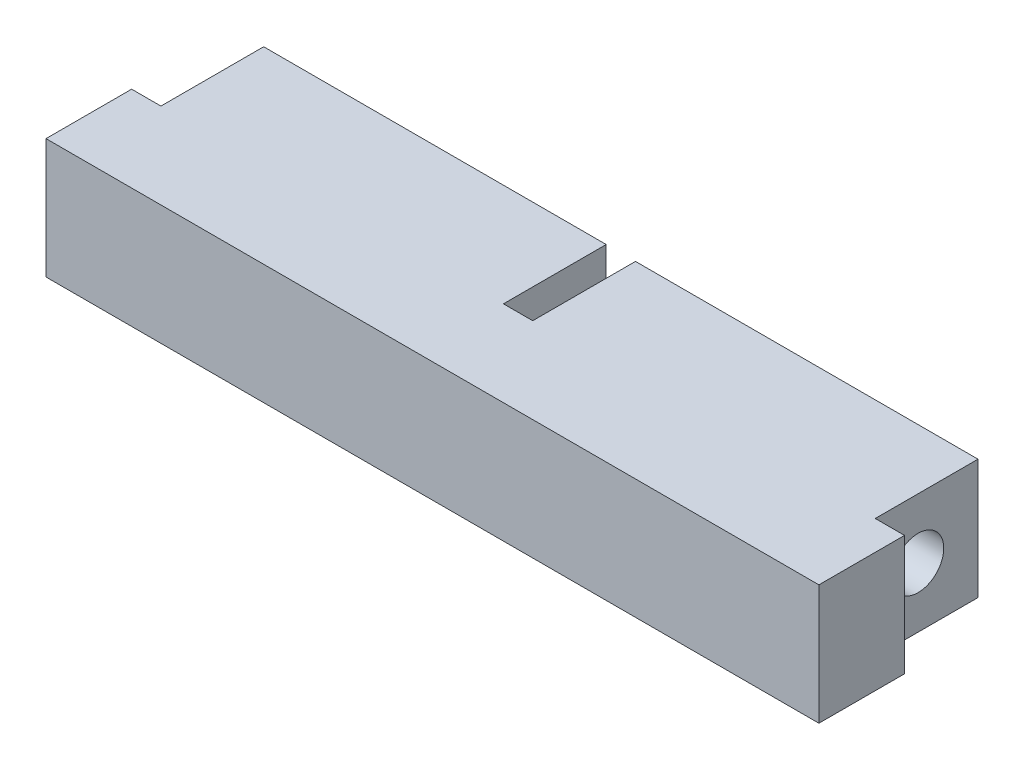
ISO-10303-21;
HEADER;
FILE_DESCRIPTION(('STEP AP214'),'2;1');
FILE_NAME('part.step','',(''),(''),'','','');
FILE_SCHEMA(('AUTOMOTIVE_DESIGN { 1 0 10303 214 1 1 1 1 }'));
ENDSEC;
DATA;
#1=APPLICATION_CONTEXT('core data for automotive mechanical design processes');
#2=APPLICATION_PROTOCOL_DEFINITION('international standard','automotive_design',2000,#1);
#3=PRODUCT_CONTEXT('',#1,'mechanical');
#4=PRODUCT('Part','Part','',(#3));
#5=PRODUCT_RELATED_PRODUCT_CATEGORY('part','',(#4));
#6=PRODUCT_DEFINITION_FORMATION('','',#4);
#7=PRODUCT_DEFINITION_CONTEXT('part definition',#1,'design');
#8=PRODUCT_DEFINITION('design','',#6,#7);
#9=PRODUCT_DEFINITION_SHAPE('','',#8);
#10=(LENGTH_UNIT() NAMED_UNIT(*) SI_UNIT(.MILLI.,.METRE.));
#11=(NAMED_UNIT(*) PLANE_ANGLE_UNIT() SI_UNIT($,.RADIAN.));
#12=(NAMED_UNIT(*) SI_UNIT($,.STERADIAN.) SOLID_ANGLE_UNIT());
#13=UNCERTAINTY_MEASURE_WITH_UNIT(LENGTH_MEASURE(1.E-05),#10,'distance_accuracy_value','');
#14=(GEOMETRIC_REPRESENTATION_CONTEXT(3) GLOBAL_UNCERTAINTY_ASSIGNED_CONTEXT((#13)) GLOBAL_UNIT_ASSIGNED_CONTEXT((#10,
#11,#12)) REPRESENTATION_CONTEXT('',''));
#15=CARTESIAN_POINT('',(0.,0.,0.));
#16=DIRECTION('',(0.,0.,1.));
#17=DIRECTION('',(1.,0.,0.));
#18=AXIS2_PLACEMENT_3D('',#15,#16,#17);
#19=CARTESIAN_POINT('',(0.,10.,0.));
#20=DIRECTION('',(-1.,0.,0.));
#21=DIRECTION('',(0.,0.,1.));
#22=AXIS2_PLACEMENT_3D('',#19,#20,#21);
#23=PLANE('',#22);
#24=DIRECTION('',(0.,1.,0.));
#25=VECTOR('',#24,1.);
#26=CARTESIAN_POINT('',(0.,0.,-6.));
#27=LINE('',#26,#25);
#28=CARTESIAN_POINT('',(0.,0.,-6.));
#29=VERTEX_POINT('',#28);
#30=CARTESIAN_POINT('',(0.,7.,-6.));
#31=VERTEX_POINT('',#30);
#32=EDGE_CURVE('E71',#29,#31,#27,.T.);
#33=ORIENTED_EDGE('',*,*,#32,.F.);
#34=DIRECTION('',(0.,0.,1.));
#35=VECTOR('',#34,1.);
#36=CARTESIAN_POINT('',(0.,0.,0.));
#37=LINE('',#36,#35);
#38=CARTESIAN_POINT('',(0.,0.,-1.));
#39=VERTEX_POINT('',#38);
#40=EDGE_CURVE('E155',#29,#39,#37,.T.);
#41=ORIENTED_EDGE('',*,*,#40,.T.);
#42=DIRECTION('',(0.,1.,0.));
#43=VECTOR('',#42,1.);
#44=CARTESIAN_POINT('',(0.,10.,-1.));
#45=LINE('',#44,#43);
#46=CARTESIAN_POINT('',(0.,7.,-1.));
#47=VERTEX_POINT('',#46);
#48=EDGE_CURVE('E263',#39,#47,#45,.T.);
#49=ORIENTED_EDGE('',*,*,#48,.T.);
#50=DIRECTION('',(0.,0.,1.));
#51=VECTOR('',#50,1.);
#52=CARTESIAN_POINT('',(0.,7.,-6.));
#53=LINE('',#52,#51);
#54=EDGE_CURVE('E167',#31,#47,#53,.T.);
#55=ORIENTED_EDGE('',*,*,#54,.F.);
#56=EDGE_LOOP('',(#33,#41,#49,#55));
#57=FACE_BOUND('',#56,.T.);
#58=ADVANCED_FACE('F48',(#57),#23,.T.);
#59=CARTESIAN_POINT('',(45.13,10.,0.));
#60=DIRECTION('',(1.,0.,0.));
#61=DIRECTION('',(0.,0.,-1.));
#62=AXIS2_PLACEMENT_3D('',#59,#60,#61);
#63=PLANE('',#62);
#64=DIRECTION('',(0.,1.,0.));
#65=VECTOR('',#64,1.);
#66=CARTESIAN_POINT('',(45.13,-87.,-1.));
#67=LINE('',#66,#65);
#68=CARTESIAN_POINT('',(45.13,0.,-1.));
#69=VERTEX_POINT('',#68);
#70=CARTESIAN_POINT('',(45.13,7.,-1.));
#71=VERTEX_POINT('',#70);
#72=EDGE_CURVE('E153',#69,#71,#67,.T.);
#73=ORIENTED_EDGE('',*,*,#72,.F.);
#74=DIRECTION('',(0.,0.,-1.));
#75=VECTOR('',#74,1.);
#76=CARTESIAN_POINT('',(45.13,0.,0.));
#77=LINE('',#76,#75);
#78=CARTESIAN_POINT('',(45.13,0.,-6.));
#79=VERTEX_POINT('',#78);
#80=EDGE_CURVE('E64',#69,#79,#77,.T.);
#81=ORIENTED_EDGE('',*,*,#80,.T.);
#82=DIRECTION('',(0.,-1.,0.));
#83=VECTOR('',#82,1.);
#84=CARTESIAN_POINT('',(45.13,7.,-6.));
#85=LINE('',#84,#83);
#86=CARTESIAN_POINT('',(45.13,7.,-6.));
#87=VERTEX_POINT('',#86);
#88=EDGE_CURVE('E151',#87,#79,#85,.T.);
#89=ORIENTED_EDGE('',*,*,#88,.F.);
#90=DIRECTION('',(0.,0.,-1.));
#91=VECTOR('',#90,1.);
#92=CARTESIAN_POINT('',(45.13,7.,0.));
#93=LINE('',#92,#91);
#94=EDGE_CURVE('E232',#71,#87,#93,.T.);
#95=ORIENTED_EDGE('',*,*,#94,.F.);
#96=EDGE_LOOP('',(#73,#81,#89,#95));
#97=FACE_BOUND('',#96,.T.);
#98=ADVANCED_FACE('F50',(#97),#63,.T.);
#99=CARTESIAN_POINT('',(23.42,0.,0.));
#100=DIRECTION('',(-1.,0.,0.));
#101=DIRECTION('',(0.,0.,1.));
#102=AXIS2_PLACEMENT_3D('',#99,#100,#101);
#103=PLANE('',#102);
#104=CARTESIAN_POINT('',(23.42,3.5,-8.5));
#105=DIRECTION('',(-1.,0.,0.));
#106=DIRECTION('',(0.,0.,1.));
#107=AXIS2_PLACEMENT_3D('',#104,#105,#106);
#108=CIRCLE('',#107,1.5);
#109=CARTESIAN_POINT('',(23.42,3.5,-7.));
#110=VERTEX_POINT('',#109);
#111=EDGE_CURVE('E189',#110,#110,#108,.T.);
#112=ORIENTED_EDGE('',*,*,#111,.F.);
#113=EDGE_LOOP('',(#112));
#114=FACE_BOUND('',#113,.T.);
#115=DIRECTION('',(0.,1.,0.));
#116=VECTOR('',#115,1.);
#117=CARTESIAN_POINT('',(23.42,0.,-12.));
#118=LINE('',#117,#116);
#119=CARTESIAN_POINT('',(23.42,0.,-12.));
#120=VERTEX_POINT('',#119);
#121=CARTESIAN_POINT('',(23.42,7.,-12.));
#122=VERTEX_POINT('',#121);
#123=EDGE_CURVE('E204',#120,#122,#118,.T.);
#124=ORIENTED_EDGE('',*,*,#123,.F.);
#125=DIRECTION('',(0.,0.,1.));
#126=VECTOR('',#125,1.);
#127=CARTESIAN_POINT('',(23.42,0.,0.));
#128=LINE('',#127,#126);
#129=CARTESIAN_POINT('',(23.42,0.,-6.));
#130=VERTEX_POINT('',#129);
#131=EDGE_CURVE('E278',#120,#130,#128,.T.);
#132=ORIENTED_EDGE('',*,*,#131,.T.);
#133=DIRECTION('',(0.,-1.,0.));
#134=VECTOR('',#133,1.);
#135=CARTESIAN_POINT('',(23.42,7.,-6.));
#136=LINE('',#135,#134);
#137=CARTESIAN_POINT('',(23.42,7.,-6.));
#138=VERTEX_POINT('',#137);
#139=EDGE_CURVE('E177',#138,#130,#136,.T.);
#140=ORIENTED_EDGE('',*,*,#139,.F.);
#141=DIRECTION('',(0.,0.,1.));
#142=VECTOR('',#141,1.);
#143=CARTESIAN_POINT('',(23.42,7.,-12.));
#144=LINE('',#143,#142);
#145=EDGE_CURVE('E230',#122,#138,#144,.T.);
#146=ORIENTED_EDGE('',*,*,#145,.F.);
#147=EDGE_LOOP('',(#124,#132,#140,#146));
#148=FACE_BOUND('',#147,.T.);
#149=ADVANCED_FACE('F318',(#114,#148),#103,.T.);
#150=CARTESIAN_POINT('',(0.,0.,-6.));
#151=DIRECTION('',(0.,0.,-1.));
#152=DIRECTION('',(-1.,0.,0.));
#153=AXIS2_PLACEMENT_3D('',#150,#151,#152);
#154=PLANE('',#153);
#155=ORIENTED_EDGE('',*,*,#139,.T.);
#156=DIRECTION('',(-1.,0.,0.));
#157=VECTOR('',#156,1.);
#158=CARTESIAN_POINT('',(0.,0.,-6.));
#159=LINE('',#158,#157);
#160=CARTESIAN_POINT('',(21.71,0.,-6.));
#161=VERTEX_POINT('',#160);
#162=EDGE_CURVE('E282',#130,#161,#159,.T.);
#163=ORIENTED_EDGE('',*,*,#162,.T.);
#164=DIRECTION('',(0.,1.,0.));
#165=VECTOR('',#164,1.);
#166=CARTESIAN_POINT('',(21.71,0.,-6.));
#167=LINE('',#166,#165);
#168=CARTESIAN_POINT('',(21.71,7.,-6.));
#169=VERTEX_POINT('',#168);
#170=EDGE_CURVE('E174',#161,#169,#167,.T.);
#171=ORIENTED_EDGE('',*,*,#170,.T.);
#172=DIRECTION('',(-1.,0.,0.));
#173=VECTOR('',#172,1.);
#174=CARTESIAN_POINT('',(23.42,7.,-6.));
#175=LINE('',#174,#173);
#176=EDGE_CURVE('E238',#138,#169,#175,.T.);
#177=ORIENTED_EDGE('',*,*,#176,.F.);
#178=EDGE_LOOP('',(#155,#163,#171,#177));
#179=FACE_BOUND('',#178,.T.);
#180=ADVANCED_FACE('F316',(#179),#154,.T.);
#181=CARTESIAN_POINT('',(21.71,0.,0.));
#182=DIRECTION('',(1.,0.,0.));
#183=DIRECTION('',(0.,0.,-1.));
#184=AXIS2_PLACEMENT_3D('',#181,#182,#183);
#185=PLANE('',#184);
#186=CARTESIAN_POINT('',(21.71,3.5,-8.5));
#187=DIRECTION('',(1.,0.,0.));
#188=DIRECTION('',(0.,0.,-1.));
#189=AXIS2_PLACEMENT_3D('',#186,#187,#188);
#190=CIRCLE('',#189,1.5);
#191=CARTESIAN_POINT('',(21.71,3.5,-10.));
#192=VERTEX_POINT('',#191);
#193=EDGE_CURVE('E185',#192,#192,#190,.T.);
#194=ORIENTED_EDGE('',*,*,#193,.F.);
#195=EDGE_LOOP('',(#194));
#196=FACE_BOUND('',#195,.T.);
#197=ORIENTED_EDGE('',*,*,#170,.F.);
#198=DIRECTION('',(0.,0.,-1.));
#199=VECTOR('',#198,1.);
#200=CARTESIAN_POINT('',(21.71,0.,0.));
#201=LINE('',#200,#199);
#202=CARTESIAN_POINT('',(21.71,0.,-12.));
#203=VERTEX_POINT('',#202);
#204=EDGE_CURVE('E286',#161,#203,#201,.T.);
#205=ORIENTED_EDGE('',*,*,#204,.T.);
#206=DIRECTION('',(0.,-1.,0.));
#207=VECTOR('',#206,1.);
#208=CARTESIAN_POINT('',(21.71,7.,-12.));
#209=LINE('',#208,#207);
#210=CARTESIAN_POINT('',(21.71,7.,-12.));
#211=VERTEX_POINT('',#210);
#212=EDGE_CURVE('E200',#211,#203,#209,.T.);
#213=ORIENTED_EDGE('',*,*,#212,.F.);
#214=DIRECTION('',(0.,0.,-1.));
#215=VECTOR('',#214,1.);
#216=CARTESIAN_POINT('',(21.71,7.,-6.));
#217=LINE('',#216,#215);
#218=EDGE_CURVE('E242',#169,#211,#217,.T.);
#219=ORIENTED_EDGE('',*,*,#218,.F.);
#220=EDGE_LOOP('',(#197,#205,#213,#219));
#221=FACE_BOUND('',#220,.T.);
#222=ADVANCED_FACE('F314',(#196,#221),#185,.T.);
#223=CARTESIAN_POINT('',(0.,0.,-12.));
#224=DIRECTION('',(0.,0.,-1.));
#225=DIRECTION('',(-1.,0.,0.));
#226=AXIS2_PLACEMENT_3D('',#223,#224,#225);
#227=PLANE('',#226);
#228=ORIENTED_EDGE('',*,*,#212,.T.);
#229=DIRECTION('',(-1.,0.,0.));
#230=VECTOR('',#229,1.);
#231=CARTESIAN_POINT('',(0.,0.,-12.));
#232=LINE('',#231,#230);
#233=CARTESIAN_POINT('',(1.71,0.,-12.));
#234=VERTEX_POINT('',#233);
#235=EDGE_CURVE('E290',#203,#234,#232,.T.);
#236=ORIENTED_EDGE('',*,*,#235,.T.);
#237=DIRECTION('',(0.,1.,0.));
#238=VECTOR('',#237,1.);
#239=CARTESIAN_POINT('',(1.71,0.,-12.));
#240=LINE('',#239,#238);
#241=CARTESIAN_POINT('',(1.71,7.,-12.));
#242=VERTEX_POINT('',#241);
#243=EDGE_CURVE('E197',#234,#242,#240,.T.);
#244=ORIENTED_EDGE('',*,*,#243,.T.);
#245=DIRECTION('',(-1.,0.,0.));
#246=VECTOR('',#245,1.);
#247=CARTESIAN_POINT('',(21.71,7.,-12.));
#248=LINE('',#247,#246);
#249=EDGE_CURVE('E246',#211,#242,#248,.T.);
#250=ORIENTED_EDGE('',*,*,#249,.F.);
#251=EDGE_LOOP('',(#228,#236,#244,#250));
#252=FACE_BOUND('',#251,.T.);
#253=ADVANCED_FACE('F309',(#252),#227,.T.);
#254=CARTESIAN_POINT('',(1.71,0.,0.));
#255=DIRECTION('',(-1.,0.,0.));
#256=DIRECTION('',(0.,0.,1.));
#257=AXIS2_PLACEMENT_3D('',#254,#255,#256);
#258=PLANE('',#257);
#259=CARTESIAN_POINT('',(1.71,3.5,-8.5));
#260=DIRECTION('',(-1.,0.,0.));
#261=DIRECTION('',(0.,0.,1.));
#262=AXIS2_PLACEMENT_3D('',#259,#260,#261);
#263=CIRCLE('',#262,1.5);
#264=CARTESIAN_POINT('',(1.71,3.5,-7.));
#265=VERTEX_POINT('',#264);
#266=EDGE_CURVE('E181',#265,#265,#263,.T.);
#267=ORIENTED_EDGE('',*,*,#266,.F.);
#268=EDGE_LOOP('',(#267));
#269=FACE_BOUND('',#268,.T.);
#270=ORIENTED_EDGE('',*,*,#243,.F.);
#271=DIRECTION('',(0.,0.,1.));
#272=VECTOR('',#271,1.);
#273=CARTESIAN_POINT('',(1.71,0.,0.));
#274=LINE('',#273,#272);
#275=CARTESIAN_POINT('',(1.71,0.,-6.));
#276=VERTEX_POINT('',#275);
#277=EDGE_CURVE('E294',#234,#276,#274,.T.);
#278=ORIENTED_EDGE('',*,*,#277,.T.);
#279=DIRECTION('',(0.,-1.,0.));
#280=VECTOR('',#279,1.);
#281=CARTESIAN_POINT('',(1.71,7.,-6.));
#282=LINE('',#281,#280);
#283=CARTESIAN_POINT('',(1.71,7.,-6.));
#284=VERTEX_POINT('',#283);
#285=EDGE_CURVE('E165',#284,#276,#282,.T.);
#286=ORIENTED_EDGE('',*,*,#285,.F.);
#287=DIRECTION('',(0.,0.,1.));
#288=VECTOR('',#287,1.);
#289=CARTESIAN_POINT('',(1.71,7.,-12.));
#290=LINE('',#289,#288);
#291=EDGE_CURVE('E250',#242,#284,#290,.T.);
#292=ORIENTED_EDGE('',*,*,#291,.F.);
#293=EDGE_LOOP('',(#270,#278,#286,#292));
#294=FACE_BOUND('',#293,.T.);
#295=ADVANCED_FACE('F305',(#269,#294),#258,.T.);
#296=CARTESIAN_POINT('',(0.,0.,-6.));
#297=DIRECTION('',(0.,0.,-1.));
#298=DIRECTION('',(-1.,0.,0.));
#299=AXIS2_PLACEMENT_3D('',#296,#297,#298);
#300=PLANE('',#299);
#301=ORIENTED_EDGE('',*,*,#285,.T.);
#302=DIRECTION('',(-1.,0.,0.));
#303=VECTOR('',#302,1.);
#304=CARTESIAN_POINT('',(0.,0.,-6.));
#305=LINE('',#304,#303);
#306=EDGE_CURVE('E298',#276,#29,#305,.T.);
#307=ORIENTED_EDGE('',*,*,#306,.T.);
#308=ORIENTED_EDGE('',*,*,#32,.T.);
#309=DIRECTION('',(-1.,0.,0.));
#310=VECTOR('',#309,1.);
#311=CARTESIAN_POINT('',(1.71,7.,-6.));
#312=LINE('',#311,#310);
#313=EDGE_CURVE('E254',#284,#31,#312,.T.);
#314=ORIENTED_EDGE('',*,*,#313,.F.);
#315=EDGE_LOOP('',(#301,#307,#308,#314));
#316=FACE_BOUND('',#315,.T.);
#317=ADVANCED_FACE('F302',(#316),#300,.T.);
#318=CARTESIAN_POINT('',(0.,0.,-6.));
#319=DIRECTION('',(0.,0.,-1.));
#320=DIRECTION('',(-1.,0.,0.));
#321=AXIS2_PLACEMENT_3D('',#318,#319,#320);
#322=PLANE('',#321);
#323=ORIENTED_EDGE('',*,*,#88,.T.);
#324=DIRECTION('',(-1.,0.,0.));
#325=VECTOR('',#324,1.);
#326=CARTESIAN_POINT('',(0.,0.,-6.));
#327=LINE('',#326,#325);
#328=CARTESIAN_POINT('',(43.42,0.,-6.));
#329=VERTEX_POINT('',#328);
#330=EDGE_CURVE('E137',#79,#329,#327,.T.);
#331=ORIENTED_EDGE('',*,*,#330,.T.);
#332=DIRECTION('',(0.,1.,0.));
#333=VECTOR('',#332,1.);
#334=CARTESIAN_POINT('',(43.42,0.,-6.));
#335=LINE('',#334,#333);
#336=CARTESIAN_POINT('',(43.42,7.,-6.));
#337=VERTEX_POINT('',#336);
#338=EDGE_CURVE('E161',#329,#337,#335,.T.);
#339=ORIENTED_EDGE('',*,*,#338,.T.);
#340=DIRECTION('',(-1.,0.,0.));
#341=VECTOR('',#340,1.);
#342=CARTESIAN_POINT('',(45.13,7.,-6.));
#343=LINE('',#342,#341);
#344=EDGE_CURVE('E159',#87,#337,#343,.T.);
#345=ORIENTED_EDGE('',*,*,#344,.F.);
#346=EDGE_LOOP('',(#323,#331,#339,#345));
#347=FACE_BOUND('',#346,.T.);
#348=ADVANCED_FACE('F157',(#347),#322,.T.);
#349=CARTESIAN_POINT('',(43.42,0.,0.));
#350=DIRECTION('',(1.,0.,0.));
#351=DIRECTION('',(0.,0.,-1.));
#352=AXIS2_PLACEMENT_3D('',#349,#350,#351);
#353=PLANE('',#352);
#354=CARTESIAN_POINT('',(43.42,3.5,-8.5));
#355=DIRECTION('',(1.,0.,0.));
#356=DIRECTION('',(0.,0.,-1.));
#357=AXIS2_PLACEMENT_3D('',#354,#355,#356);
#358=CIRCLE('',#357,1.5);
#359=CARTESIAN_POINT('',(43.42,3.5,-10.));
#360=VERTEX_POINT('',#359);
#361=EDGE_CURVE('E193',#360,#360,#358,.T.);
#362=ORIENTED_EDGE('',*,*,#361,.F.);
#363=EDGE_LOOP('',(#362));
#364=FACE_BOUND('',#363,.T.);
#365=ORIENTED_EDGE('',*,*,#338,.F.);
#366=DIRECTION('',(0.,0.,-1.));
#367=VECTOR('',#366,1.);
#368=CARTESIAN_POINT('',(43.42,0.,0.));
#369=LINE('',#368,#367);
#370=CARTESIAN_POINT('',(43.42,0.,-12.));
#371=VERTEX_POINT('',#370);
#372=EDGE_CURVE('E140',#329,#371,#369,.T.);
#373=ORIENTED_EDGE('',*,*,#372,.T.);
#374=DIRECTION('',(0.,-1.,0.));
#375=VECTOR('',#374,1.);
#376=CARTESIAN_POINT('',(43.42,7.,-12.));
#377=LINE('',#376,#375);
#378=CARTESIAN_POINT('',(43.42,7.,-12.));
#379=VERTEX_POINT('',#378);
#380=EDGE_CURVE('E57',#379,#371,#377,.T.);
#381=ORIENTED_EDGE('',*,*,#380,.F.);
#382=DIRECTION('',(0.,0.,-1.));
#383=VECTOR('',#382,1.);
#384=CARTESIAN_POINT('',(43.42,7.,-6.));
#385=LINE('',#384,#383);
#386=EDGE_CURVE('E220',#337,#379,#385,.T.);
#387=ORIENTED_EDGE('',*,*,#386,.F.);
#388=EDGE_LOOP('',(#365,#373,#381,#387));
#389=FACE_BOUND('',#388,.T.);
#390=ADVANCED_FACE('F219',(#364,#389),#353,.T.);
#391=CARTESIAN_POINT('',(0.,0.,-12.));
#392=DIRECTION('',(0.,0.,-1.));
#393=DIRECTION('',(-1.,0.,0.));
#394=AXIS2_PLACEMENT_3D('',#391,#392,#393);
#395=PLANE('',#394);
#396=ORIENTED_EDGE('',*,*,#380,.T.);
#397=DIRECTION('',(-1.,0.,0.));
#398=VECTOR('',#397,1.);
#399=CARTESIAN_POINT('',(0.,0.,-12.));
#400=LINE('',#399,#398);
#401=EDGE_CURVE('E212',#371,#120,#400,.T.);
#402=ORIENTED_EDGE('',*,*,#401,.T.);
#403=ORIENTED_EDGE('',*,*,#123,.T.);
#404=DIRECTION('',(-1.,0.,0.));
#405=VECTOR('',#404,1.);
#406=CARTESIAN_POINT('',(43.42,7.,-12.));
#407=LINE('',#406,#405);
#408=EDGE_CURVE('E215',#379,#122,#407,.T.);
#409=ORIENTED_EDGE('',*,*,#408,.F.);
#410=EDGE_LOOP('',(#396,#402,#403,#409));
#411=FACE_BOUND('',#410,.T.);
#412=ADVANCED_FACE('F211',(#411),#395,.T.);
#413=CARTESIAN_POINT('',(0.,-87.,-1.));
#414=DIRECTION('',(0.,0.,1.));
#415=DIRECTION('',(1.,0.,0.));
#416=AXIS2_PLACEMENT_3D('',#413,#414,#415);
#417=PLANE('',#416);
#418=ORIENTED_EDGE('',*,*,#48,.F.);
#419=DIRECTION('',(1.,0.,0.));
#420=VECTOR('',#419,1.);
#421=CARTESIAN_POINT('',(0.,0.,-1.));
#422=LINE('',#421,#420);
#423=EDGE_CURVE('E11',#39,#69,#422,.T.);
#424=ORIENTED_EDGE('',*,*,#423,.T.);
#425=ORIENTED_EDGE('',*,*,#72,.T.);
#426=DIRECTION('',(1.,0.,0.));
#427=VECTOR('',#426,1.);
#428=CARTESIAN_POINT('',(0.,7.,-1.));
#429=LINE('',#428,#427);
#430=EDGE_CURVE('E145',#47,#71,#429,.T.);
#431=ORIENTED_EDGE('',*,*,#430,.F.);
#432=EDGE_LOOP('',(#418,#424,#425,#431));
#433=FACE_BOUND('',#432,.T.);
#434=ADVANCED_FACE('F267',(#433),#417,.T.);
#435=CARTESIAN_POINT('',(4.59279924438858,7.,7.));
#436=DIRECTION('',(0.,1.,0.));
#437=DIRECTION('',(0.,0.,1.));
#438=AXIS2_PLACEMENT_3D('',#435,#436,#437);
#439=PLANE('',#438);
#440=ORIENTED_EDGE('',*,*,#54,.T.);
#441=ORIENTED_EDGE('',*,*,#430,.T.);
#442=ORIENTED_EDGE('',*,*,#94,.T.);
#443=ORIENTED_EDGE('',*,*,#344,.T.);
#444=ORIENTED_EDGE('',*,*,#386,.T.);
#445=ORIENTED_EDGE('',*,*,#408,.T.);
#446=ORIENTED_EDGE('',*,*,#145,.T.);
#447=ORIENTED_EDGE('',*,*,#176,.T.);
#448=ORIENTED_EDGE('',*,*,#218,.T.);
#449=ORIENTED_EDGE('',*,*,#249,.T.);
#450=ORIENTED_EDGE('',*,*,#291,.T.);
#451=ORIENTED_EDGE('',*,*,#313,.T.);
#452=EDGE_LOOP('',(#440,#441,#442,#443,#444,#445,#446,#447,#448,#449,#450,#451));
#453=FACE_BOUND('',#452,.T.);
#454=ADVANCED_FACE('F223',(#453),#439,.T.);
#455=CARTESIAN_POINT('',(45.71,3.5,-8.5));
#456=DIRECTION('',(-1.,0.,0.));
#457=DIRECTION('',(0.,0.,1.));
#458=AXIS2_PLACEMENT_3D('',#455,#456,#457);
#459=CYLINDRICAL_SURFACE('',#458,1.5);
#460=ORIENTED_EDGE('',*,*,#193,.T.);
#461=EDGE_LOOP('',(#460));
#462=FACE_BOUND('',#461,.T.);
#463=ORIENTED_EDGE('',*,*,#266,.T.);
#464=EDGE_LOOP('',(#463));
#465=FACE_BOUND('',#464,.T.);
#466=ADVANCED_FACE('F346',(#462,#465),#459,.F.);
#467=ORIENTED_EDGE('',*,*,#361,.T.);
#468=EDGE_LOOP('',(#467));
#469=FACE_BOUND('',#468,.T.);
#470=ORIENTED_EDGE('',*,*,#111,.T.);
#471=EDGE_LOOP('',(#470));
#472=FACE_BOUND('',#471,.T.);
#473=ADVANCED_FACE('F343',(#469,#472),#459,.F.);
#474=CARTESIAN_POINT('',(-48.87,0.,0.));
#475=DIRECTION('',(0.,-1.,0.));
#476=DIRECTION('',(0.,0.,-1.));
#477=AXIS2_PLACEMENT_3D('',#474,#475,#476);
#478=PLANE('',#477);
#479=ORIENTED_EDGE('',*,*,#80,.F.);
#480=ORIENTED_EDGE('',*,*,#423,.F.);
#481=ORIENTED_EDGE('',*,*,#40,.F.);
#482=ORIENTED_EDGE('',*,*,#306,.F.);
#483=ORIENTED_EDGE('',*,*,#277,.F.);
#484=ORIENTED_EDGE('',*,*,#235,.F.);
#485=ORIENTED_EDGE('',*,*,#204,.F.);
#486=ORIENTED_EDGE('',*,*,#162,.F.);
#487=ORIENTED_EDGE('',*,*,#131,.F.);
#488=ORIENTED_EDGE('',*,*,#401,.F.);
#489=ORIENTED_EDGE('',*,*,#372,.F.);
#490=ORIENTED_EDGE('',*,*,#330,.F.);
#491=EDGE_LOOP('',(#479,#480,#481,#482,#483,#484,#485,#486,#487,#488,#489,#490));
#492=FACE_BOUND('',#491,.T.);
#493=ADVANCED_FACE('F138',(#492),#478,.T.);
#494=CLOSED_SHELL('',(#58,#98,#149,#180,#222,#253,#295,#317,#348,#390,#412,#434,#454,#466,#473,#493));
#495=MANIFOLD_SOLID_BREP('B2',#494);
#496=ADVANCED_BREP_SHAPE_REPRESENTATION('',(#18,#495),#14);
#497=SHAPE_DEFINITION_REPRESENTATION(#9,#496);
ENDSEC;
END-ISO-10303-21;
